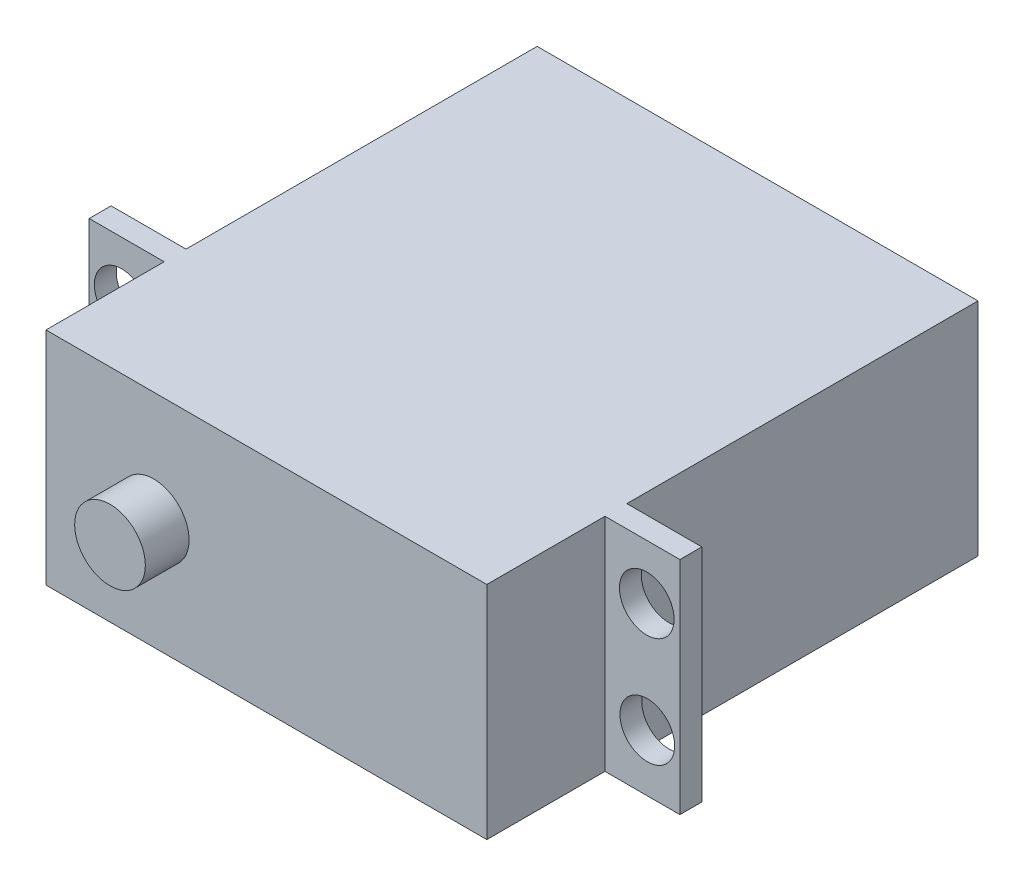
ISO-10303-21;
HEADER;
FILE_DESCRIPTION(('STEP AP214'),'2;1');
FILE_NAME('part.step','',(''),(''),'','','');
FILE_SCHEMA(('AUTOMOTIVE_DESIGN { 1 0 10303 214 1 1 1 1 }'));
ENDSEC;
DATA;
#1=APPLICATION_CONTEXT('core data for automotive mechanical design processes');
#2=APPLICATION_PROTOCOL_DEFINITION('international standard','automotive_design',2000,#1);
#3=PRODUCT_CONTEXT('',#1,'mechanical');
#4=PRODUCT('Part','Part','',(#3));
#5=PRODUCT_RELATED_PRODUCT_CATEGORY('part','',(#4));
#6=PRODUCT_DEFINITION_FORMATION('','',#4);
#7=PRODUCT_DEFINITION_CONTEXT('part definition',#1,'design');
#8=PRODUCT_DEFINITION('design','',#6,#7);
#9=PRODUCT_DEFINITION_SHAPE('','',#8);
#10=(LENGTH_UNIT() NAMED_UNIT(*) SI_UNIT(.MILLI.,.METRE.));
#11=(NAMED_UNIT(*) PLANE_ANGLE_UNIT() SI_UNIT($,.RADIAN.));
#12=(NAMED_UNIT(*) SI_UNIT($,.STERADIAN.) SOLID_ANGLE_UNIT());
#13=UNCERTAINTY_MEASURE_WITH_UNIT(LENGTH_MEASURE(1.E-05),#10,'distance_accuracy_value','');
#14=(GEOMETRIC_REPRESENTATION_CONTEXT(3) GLOBAL_UNCERTAINTY_ASSIGNED_CONTEXT((#13)) GLOBAL_UNIT_ASSIGNED_CONTEXT((#10,
#11,#12)) REPRESENTATION_CONTEXT('',''));
#15=CARTESIAN_POINT('',(0.,0.,0.));
#16=DIRECTION('',(0.,0.,1.));
#17=DIRECTION('',(1.,0.,0.));
#18=AXIS2_PLACEMENT_3D('',#15,#16,#17);
#19=CARTESIAN_POINT('',(0.,0.,34.1));
#20=DIRECTION('',(0.,0.,1.));
#21=DIRECTION('',(1.,0.,0.));
#22=AXIS2_PLACEMENT_3D('',#19,#20,#21);
#23=PLANE('',#22);
#24=CARTESIAN_POINT('',(-3.83205536866129,0.591291405632442,34.1));
#25=DIRECTION('',(0.,0.,1.));
#26=DIRECTION('',(1.,0.,0.));
#27=AXIS2_PLACEMENT_3D('',#24,#25,#26);
#28=CIRCLE('',#27,2.5);
#29=CARTESIAN_POINT('',(-1.33205536866129,0.591291405632442,34.1));
#30=VERTEX_POINT('',#29);
#31=EDGE_CURVE('E193',#30,#30,#28,.T.);
#32=ORIENTED_EDGE('',*,*,#31,.F.);
#33=EDGE_LOOP('',(#32));
#34=FACE_BOUND('',#33,.T.);
#35=CARTESIAN_POINT('',(-3.87999999999999,10.5911764705882,34.1));
#36=DIRECTION('',(0.,0.,1.));
#37=DIRECTION('',(1.,0.,0.));
#38=AXIS2_PLACEMENT_3D('',#35,#36,#37);
#39=CIRCLE('',#38,2.5);
#40=CARTESIAN_POINT('',(-1.37999999999999,10.5911764705882,34.1));
#41=VERTEX_POINT('',#40);
#42=EDGE_CURVE('E190',#41,#41,#39,.T.);
#43=ORIENTED_EDGE('',*,*,#42,.F.);
#44=EDGE_LOOP('',(#43));
#45=FACE_BOUND('',#44,.T.);
#46=DIRECTION('',(0.,-1.,0.));
#47=VECTOR('',#46,1.);
#48=CARTESIAN_POINT('',(0.,-4.60882352941177,34.1));
#49=LINE('',#48,#47);
#50=CARTESIAN_POINT('',(0.,15.5911764705882,34.1));
#51=VERTEX_POINT('',#50);
#52=CARTESIAN_POINT('',(0.,-4.60882352941177,34.1));
#53=VERTEX_POINT('',#52);
#54=EDGE_CURVE('E54',#51,#53,#49,.T.);
#55=ORIENTED_EDGE('',*,*,#54,.F.);
#56=DIRECTION('',(-1.,0.,0.));
#57=VECTOR('',#56,1.);
#58=CARTESIAN_POINT('',(-6.85,15.5911764705882,34.1));
#59=LINE('',#58,#57);
#60=CARTESIAN_POINT('',(-6.85,15.5911764705882,34.1));
#61=VERTEX_POINT('',#60);
#62=EDGE_CURVE('E177',#51,#61,#59,.T.);
#63=ORIENTED_EDGE('',*,*,#62,.T.);
#64=DIRECTION('',(0.,-1.,0.));
#65=VECTOR('',#64,1.);
#66=CARTESIAN_POINT('',(-6.85,15.5911764705882,34.1));
#67=LINE('',#66,#65);
#68=CARTESIAN_POINT('',(-6.85,-4.60882352941177,34.1));
#69=VERTEX_POINT('',#68);
#70=EDGE_CURVE('E172',#61,#69,#67,.T.);
#71=ORIENTED_EDGE('',*,*,#70,.T.);
#72=DIRECTION('',(1.,0.,0.));
#73=VECTOR('',#72,1.);
#74=CARTESIAN_POINT('',(-6.85,-4.60882352941177,34.1));
#75=LINE('',#74,#73);
#76=EDGE_CURVE('E286',#69,#53,#75,.T.);
#77=ORIENTED_EDGE('',*,*,#76,.T.);
#78=EDGE_LOOP('',(#55,#63,#71,#77));
#79=FACE_BOUND('',#78,.T.);
#80=ADVANCED_FACE('F37',(#34,#45,#79),#23,.T.);
#81=CARTESIAN_POINT('',(0.,15.5911764705882,32.1));
#82=DIRECTION('',(1.,0.,0.));
#83=DIRECTION('',(0.,1.,0.));
#84=AXIS2_PLACEMENT_3D('',#81,#82,#83);
#85=PLANE('',#84);
#86=DIRECTION('',(0.,-1.,0.));
#87=VECTOR('',#86,1.);
#88=CARTESIAN_POINT('',(0.,15.5911764705882,0.));
#89=LINE('',#88,#87);
#90=CARTESIAN_POINT('',(0.,15.5911764705882,0.));
#91=VERTEX_POINT('',#90);
#92=CARTESIAN_POINT('',(0.,-4.60882352941177,0.));
#93=VERTEX_POINT('',#92);
#94=EDGE_CURVE('E268',#91,#93,#89,.T.);
#95=ORIENTED_EDGE('',*,*,#94,.T.);
#96=DIRECTION('',(0.,0.,-1.));
#97=VECTOR('',#96,1.);
#98=CARTESIAN_POINT('',(0.,-4.60882352941177,32.1));
#99=LINE('',#98,#97);
#100=CARTESIAN_POINT('',(0.,-4.60882352941177,32.1));
#101=VERTEX_POINT('',#100);
#102=EDGE_CURVE('E46',#101,#93,#99,.T.);
#103=ORIENTED_EDGE('',*,*,#102,.F.);
#104=DIRECTION('',(0.,-1.,0.));
#105=VECTOR('',#104,1.);
#106=CARTESIAN_POINT('',(0.,15.5911764705882,32.1));
#107=LINE('',#106,#105);
#108=CARTESIAN_POINT('',(0.,15.5911764705882,32.1));
#109=VERTEX_POINT('',#108);
#110=EDGE_CURVE('E301',#109,#101,#107,.T.);
#111=ORIENTED_EDGE('',*,*,#110,.F.);
#112=DIRECTION('',(0.,0.,-1.));
#113=VECTOR('',#112,1.);
#114=CARTESIAN_POINT('',(0.,15.5911764705882,32.1));
#115=LINE('',#114,#113);
#116=EDGE_CURVE('E292',#109,#91,#115,.T.);
#117=ORIENTED_EDGE('',*,*,#116,.T.);
#118=EDGE_LOOP('',(#95,#103,#111,#117));
#119=FACE_BOUND('',#118,.T.);
#120=ADVANCED_FACE('F39',(#119),#85,.F.);
#121=CARTESIAN_POINT('',(0.,-4.60882352941177,32.1));
#122=DIRECTION('',(0.,1.,0.));
#123=DIRECTION('',(0.,0.,1.));
#124=AXIS2_PLACEMENT_3D('',#121,#122,#123);
#125=PLANE('',#124);
#126=DIRECTION('',(1.,0.,0.));
#127=VECTOR('',#126,1.);
#128=CARTESIAN_POINT('',(0.,-4.60882352941177,0.));
#129=LINE('',#128,#127);
#130=CARTESIAN_POINT('',(40.3,-4.60882352941177,0.));
#131=VERTEX_POINT('',#130);
#132=EDGE_CURVE('E316',#93,#131,#129,.T.);
#133=ORIENTED_EDGE('',*,*,#132,.T.);
#134=DIRECTION('',(0.,0.,-1.));
#135=VECTOR('',#134,1.);
#136=CARTESIAN_POINT('',(40.3,-4.60882352941177,32.1));
#137=LINE('',#136,#135);
#138=CARTESIAN_POINT('',(40.3,-4.60882352941177,32.1));
#139=VERTEX_POINT('',#138);
#140=EDGE_CURVE('E300',#139,#131,#137,.T.);
#141=ORIENTED_EDGE('',*,*,#140,.F.);
#142=DIRECTION('',(1.,0.,0.));
#143=VECTOR('',#142,1.);
#144=CARTESIAN_POINT('',(-6.85,-4.60882352941177,32.1));
#145=LINE('',#144,#143);
#146=CARTESIAN_POINT('',(47.15,-4.60882352941177,32.1));
#147=VERTEX_POINT('',#146);
#148=EDGE_CURVE('E152',#139,#147,#145,.T.);
#149=ORIENTED_EDGE('',*,*,#148,.T.);
#150=DIRECTION('',(0.,0.,-1.));
#151=VECTOR('',#150,1.);
#152=CARTESIAN_POINT('',(47.15,-4.60882352941177,34.1));
#153=LINE('',#152,#151);
#154=CARTESIAN_POINT('',(47.15,-4.60882352941177,34.1));
#155=VERTEX_POINT('',#154);
#156=EDGE_CURVE('E269',#155,#147,#153,.T.);
#157=ORIENTED_EDGE('',*,*,#156,.F.);
#158=CARTESIAN_POINT('',(40.3,-4.60882352941177,34.1));
#159=VERTEX_POINT('',#158);
#160=EDGE_CURVE('E281',#159,#155,#75,.T.);
#161=ORIENTED_EDGE('',*,*,#160,.F.);
#162=DIRECTION('',(0.,0.,-1.));
#163=VECTOR('',#162,1.);
#164=CARTESIAN_POINT('',(40.3,-4.60882352941177,44.9));
#165=LINE('',#164,#163);
#166=CARTESIAN_POINT('',(40.3,-4.60882352941177,44.9));
#167=VERTEX_POINT('',#166);
#168=EDGE_CURVE('E134',#167,#159,#165,.T.);
#169=ORIENTED_EDGE('',*,*,#168,.F.);
#170=DIRECTION('',(1.,0.,0.));
#171=VECTOR('',#170,1.);
#172=CARTESIAN_POINT('',(0.,-4.60882352941177,44.9));
#173=LINE('',#172,#171);
#174=CARTESIAN_POINT('',(0.,-4.60882352941177,44.9));
#175=VERTEX_POINT('',#174);
#176=EDGE_CURVE('E128',#175,#167,#173,.T.);
#177=ORIENTED_EDGE('',*,*,#176,.F.);
#178=DIRECTION('',(0.,0.,-1.));
#179=VECTOR('',#178,1.);
#180=CARTESIAN_POINT('',(0.,-4.60882352941177,44.9));
#181=LINE('',#180,#179);
#182=EDGE_CURVE('E132',#175,#53,#181,.T.);
#183=ORIENTED_EDGE('',*,*,#182,.T.);
#184=ORIENTED_EDGE('',*,*,#76,.F.);
#185=DIRECTION('',(0.,0.,-1.));
#186=VECTOR('',#185,1.);
#187=CARTESIAN_POINT('',(-6.85,-4.60882352941177,34.1));
#188=LINE('',#187,#186);
#189=CARTESIAN_POINT('',(-6.85,-4.60882352941177,32.1));
#190=VERTEX_POINT('',#189);
#191=EDGE_CURVE('E265',#69,#190,#188,.T.);
#192=ORIENTED_EDGE('',*,*,#191,.T.);
#193=EDGE_CURVE('E243',#190,#101,#145,.T.);
#194=ORIENTED_EDGE('',*,*,#193,.T.);
#195=ORIENTED_EDGE('',*,*,#102,.T.);
#196=EDGE_LOOP('',(#133,#141,#149,#157,#161,#169,#177,#183,#184,#192,#194,#195));
#197=FACE_BOUND('',#196,.T.);
#198=ADVANCED_FACE('F130',(#197),#125,.F.);
#199=CARTESIAN_POINT('',(40.3,15.5911764705882,32.1));
#200=DIRECTION('',(-1.,0.,0.));
#201=DIRECTION('',(0.,-1.,0.));
#202=AXIS2_PLACEMENT_3D('',#199,#200,#201);
#203=PLANE('',#202);
#204=DIRECTION('',(0.,1.,0.));
#205=VECTOR('',#204,1.);
#206=CARTESIAN_POINT('',(40.3,15.5911764705882,0.));
#207=LINE('',#206,#205);
#208=CARTESIAN_POINT('',(40.3,15.5911764705882,0.));
#209=VERTEX_POINT('',#208);
#210=EDGE_CURVE('E318',#131,#209,#207,.T.);
#211=ORIENTED_EDGE('',*,*,#210,.T.);
#212=DIRECTION('',(0.,0.,-1.));
#213=VECTOR('',#212,1.);
#214=CARTESIAN_POINT('',(40.3,15.5911764705882,32.1));
#215=LINE('',#214,#213);
#216=CARTESIAN_POINT('',(40.3,15.5911764705882,32.1));
#217=VERTEX_POINT('',#216);
#218=EDGE_CURVE('E295',#217,#209,#215,.T.);
#219=ORIENTED_EDGE('',*,*,#218,.F.);
#220=DIRECTION('',(0.,1.,0.));
#221=VECTOR('',#220,1.);
#222=CARTESIAN_POINT('',(40.3,15.5911764705882,32.1));
#223=LINE('',#222,#221);
#224=EDGE_CURVE('E238',#139,#217,#223,.T.);
#225=ORIENTED_EDGE('',*,*,#224,.F.);
#226=ORIENTED_EDGE('',*,*,#140,.T.);
#227=EDGE_LOOP('',(#211,#219,#225,#226));
#228=FACE_BOUND('',#227,.T.);
#229=ADVANCED_FACE('F459',(#228),#203,.F.);
#230=CARTESIAN_POINT('',(0.,15.5911764705882,32.1));
#231=DIRECTION('',(0.,-1.,0.));
#232=DIRECTION('',(0.,0.,-1.));
#233=AXIS2_PLACEMENT_3D('',#230,#231,#232);
#234=PLANE('',#233);
#235=DIRECTION('',(-1.,0.,0.));
#236=VECTOR('',#235,1.);
#237=CARTESIAN_POINT('',(0.,15.5911764705882,0.));
#238=LINE('',#237,#236);
#239=EDGE_CURVE('E304',#209,#91,#238,.T.);
#240=ORIENTED_EDGE('',*,*,#239,.T.);
#241=ORIENTED_EDGE('',*,*,#116,.F.);
#242=DIRECTION('',(-1.,0.,0.));
#243=VECTOR('',#242,1.);
#244=CARTESIAN_POINT('',(-6.85,15.5911764705882,32.1));
#245=LINE('',#244,#243);
#246=CARTESIAN_POINT('',(-6.85,15.5911764705882,32.1));
#247=VERTEX_POINT('',#246);
#248=EDGE_CURVE('E256',#109,#247,#245,.T.);
#249=ORIENTED_EDGE('',*,*,#248,.T.);
#250=DIRECTION('',(0.,0.,-1.));
#251=VECTOR('',#250,1.);
#252=CARTESIAN_POINT('',(-6.85,15.5911764705882,34.1));
#253=LINE('',#252,#251);
#254=EDGE_CURVE('E259',#61,#247,#253,.T.);
#255=ORIENTED_EDGE('',*,*,#254,.F.);
#256=ORIENTED_EDGE('',*,*,#62,.F.);
#257=DIRECTION('',(0.,0.,-1.));
#258=VECTOR('',#257,1.);
#259=CARTESIAN_POINT('',(0.,15.5911764705882,44.9));
#260=LINE('',#259,#258);
#261=CARTESIAN_POINT('',(0.,15.5911764705882,44.9));
#262=VERTEX_POINT('',#261);
#263=EDGE_CURVE('E164',#262,#51,#260,.T.);
#264=ORIENTED_EDGE('',*,*,#263,.F.);
#265=DIRECTION('',(-1.,0.,0.));
#266=VECTOR('',#265,1.);
#267=CARTESIAN_POINT('',(0.,15.5911764705882,44.9));
#268=LINE('',#267,#266);
#269=CARTESIAN_POINT('',(40.3,15.5911764705882,44.9));
#270=VERTEX_POINT('',#269);
#271=EDGE_CURVE('E143',#270,#262,#268,.T.);
#272=ORIENTED_EDGE('',*,*,#271,.F.);
#273=DIRECTION('',(0.,0.,-1.));
#274=VECTOR('',#273,1.);
#275=CARTESIAN_POINT('',(40.3,15.5911764705882,44.9));
#276=LINE('',#275,#274);
#277=CARTESIAN_POINT('',(40.3,15.5911764705882,34.1));
#278=VERTEX_POINT('',#277);
#279=EDGE_CURVE('E154',#270,#278,#276,.T.);
#280=ORIENTED_EDGE('',*,*,#279,.T.);
#281=CARTESIAN_POINT('',(47.15,15.5911764705882,34.1));
#282=VERTEX_POINT('',#281);
#283=EDGE_CURVE('E274',#282,#278,#59,.T.);
#284=ORIENTED_EDGE('',*,*,#283,.F.);
#285=DIRECTION('',(0.,0.,-1.));
#286=VECTOR('',#285,1.);
#287=CARTESIAN_POINT('',(47.15,15.5911764705882,34.1));
#288=LINE('',#287,#286);
#289=CARTESIAN_POINT('',(47.15,15.5911764705882,32.1));
#290=VERTEX_POINT('',#289);
#291=EDGE_CURVE('E270',#282,#290,#288,.T.);
#292=ORIENTED_EDGE('',*,*,#291,.T.);
#293=EDGE_CURVE('E263',#290,#217,#245,.T.);
#294=ORIENTED_EDGE('',*,*,#293,.T.);
#295=ORIENTED_EDGE('',*,*,#218,.T.);
#296=EDGE_LOOP('',(#240,#241,#249,#255,#256,#264,#272,#280,#284,#292,#294,#295));
#297=FACE_BOUND('',#296,.T.);
#298=ADVANCED_FACE('F322',(#297),#234,.F.);
#299=CARTESIAN_POINT('',(0.,0.,0.));
#300=DIRECTION('',(0.,0.,1.));
#301=DIRECTION('',(1.,0.,0.));
#302=AXIS2_PLACEMENT_3D('',#299,#300,#301);
#303=PLANE('',#302);
#304=ORIENTED_EDGE('',*,*,#94,.F.);
#305=ORIENTED_EDGE('',*,*,#239,.F.);
#306=ORIENTED_EDGE('',*,*,#210,.F.);
#307=ORIENTED_EDGE('',*,*,#132,.F.);
#308=EDGE_LOOP('',(#304,#305,#306,#307));
#309=FACE_BOUND('',#308,.T.);
#310=ADVANCED_FACE('F327',(#309),#303,.F.);
#311=CARTESIAN_POINT('',(0.,0.,32.1));
#312=DIRECTION('',(0.,0.,1.));
#313=DIRECTION('',(1.,0.,0.));
#314=AXIS2_PLACEMENT_3D('',#311,#312,#313);
#315=PLANE('',#314);
#316=CARTESIAN_POINT('',(-3.83205536866129,0.591291405632442,32.1));
#317=DIRECTION('',(0.,0.,1.));
#318=DIRECTION('',(1.,0.,0.));
#319=AXIS2_PLACEMENT_3D('',#316,#317,#318);
#320=CIRCLE('',#319,2.5);
#321=CARTESIAN_POINT('',(-1.33205536866129,0.591291405632442,32.1));
#322=VERTEX_POINT('',#321);
#323=EDGE_CURVE('E41',#322,#322,#320,.T.);
#324=ORIENTED_EDGE('',*,*,#323,.T.);
#325=EDGE_LOOP('',(#324));
#326=FACE_BOUND('',#325,.T.);
#327=CARTESIAN_POINT('',(-3.87999999999999,10.5911764705882,32.1));
#328=DIRECTION('',(0.,0.,1.));
#329=DIRECTION('',(1.,0.,0.));
#330=AXIS2_PLACEMENT_3D('',#327,#328,#329);
#331=CIRCLE('',#330,2.5);
#332=CARTESIAN_POINT('',(-1.37999999999999,10.5911764705882,32.1));
#333=VERTEX_POINT('',#332);
#334=EDGE_CURVE('E189',#333,#333,#331,.T.);
#335=ORIENTED_EDGE('',*,*,#334,.T.);
#336=EDGE_LOOP('',(#335));
#337=FACE_BOUND('',#336,.T.);
#338=ORIENTED_EDGE('',*,*,#248,.F.);
#339=ORIENTED_EDGE('',*,*,#110,.T.);
#340=ORIENTED_EDGE('',*,*,#193,.F.);
#341=DIRECTION('',(0.,-1.,0.));
#342=VECTOR('',#341,1.);
#343=CARTESIAN_POINT('',(-6.85,15.5911764705882,32.1));
#344=LINE('',#343,#342);
#345=EDGE_CURVE('E149',#247,#190,#344,.T.);
#346=ORIENTED_EDGE('',*,*,#345,.F.);
#347=EDGE_LOOP('',(#338,#339,#340,#346));
#348=FACE_BOUND('',#347,.T.);
#349=ADVANCED_FACE('F230',(#326,#337,#348),#315,.F.);
#350=CARTESIAN_POINT('',(44.1679446313387,0.591291405632438,32.1));
#351=DIRECTION('',(0.,0.,1.));
#352=DIRECTION('',(1.,0.,0.));
#353=AXIS2_PLACEMENT_3D('',#350,#351,#352);
#354=CIRCLE('',#353,2.5);
#355=CARTESIAN_POINT('',(46.6679446313387,0.591291405632438,32.1));
#356=VERTEX_POINT('',#355);
#357=EDGE_CURVE('E202',#356,#356,#354,.T.);
#358=ORIENTED_EDGE('',*,*,#357,.T.);
#359=EDGE_LOOP('',(#358));
#360=FACE_BOUND('',#359,.T.);
#361=CARTESIAN_POINT('',(44.12,10.5911764705882,32.1));
#362=DIRECTION('',(0.,0.,1.));
#363=DIRECTION('',(1.,0.,0.));
#364=AXIS2_PLACEMENT_3D('',#361,#362,#363);
#365=CIRCLE('',#364,2.5);
#366=CARTESIAN_POINT('',(46.62,10.5911764705882,32.1));
#367=VERTEX_POINT('',#366);
#368=EDGE_CURVE('E196',#367,#367,#365,.T.);
#369=ORIENTED_EDGE('',*,*,#368,.T.);
#370=EDGE_LOOP('',(#369));
#371=FACE_BOUND('',#370,.T.);
#372=ORIENTED_EDGE('',*,*,#148,.F.);
#373=ORIENTED_EDGE('',*,*,#224,.T.);
#374=ORIENTED_EDGE('',*,*,#293,.F.);
#375=DIRECTION('',(0.,1.,0.));
#376=VECTOR('',#375,1.);
#377=CARTESIAN_POINT('',(47.15,15.5911764705882,32.1));
#378=LINE('',#377,#376);
#379=EDGE_CURVE('E240',#147,#290,#378,.T.);
#380=ORIENTED_EDGE('',*,*,#379,.F.);
#381=EDGE_LOOP('',(#372,#373,#374,#380));
#382=FACE_BOUND('',#381,.T.);
#383=ADVANCED_FACE('F226',(#360,#371,#382),#315,.F.);
#384=CARTESIAN_POINT('',(-6.85,15.5911764705882,34.1));
#385=DIRECTION('',(1.,0.,0.));
#386=DIRECTION('',(0.,1.,0.));
#387=AXIS2_PLACEMENT_3D('',#384,#385,#386);
#388=PLANE('',#387);
#389=ORIENTED_EDGE('',*,*,#345,.T.);
#390=ORIENTED_EDGE('',*,*,#191,.F.);
#391=ORIENTED_EDGE('',*,*,#70,.F.);
#392=ORIENTED_EDGE('',*,*,#254,.T.);
#393=EDGE_LOOP('',(#389,#390,#391,#392));
#394=FACE_BOUND('',#393,.T.);
#395=ADVANCED_FACE('F229',(#394),#388,.F.);
#396=CARTESIAN_POINT('',(47.15,15.5911764705882,34.1));
#397=DIRECTION('',(-1.,0.,0.));
#398=DIRECTION('',(0.,0.,1.));
#399=AXIS2_PLACEMENT_3D('',#396,#397,#398);
#400=PLANE('',#399);
#401=ORIENTED_EDGE('',*,*,#379,.T.);
#402=ORIENTED_EDGE('',*,*,#291,.F.);
#403=DIRECTION('',(0.,1.,0.));
#404=VECTOR('',#403,1.);
#405=CARTESIAN_POINT('',(47.15,15.5911764705882,34.1));
#406=LINE('',#405,#404);
#407=EDGE_CURVE('E279',#155,#282,#406,.T.);
#408=ORIENTED_EDGE('',*,*,#407,.F.);
#409=ORIENTED_EDGE('',*,*,#156,.T.);
#410=EDGE_LOOP('',(#401,#402,#408,#409));
#411=FACE_BOUND('',#410,.T.);
#412=ADVANCED_FACE('F215',(#411),#400,.F.);
#413=CARTESIAN_POINT('',(44.1679446313387,0.591291405632438,34.1));
#414=DIRECTION('',(0.,0.,1.));
#415=DIRECTION('',(1.,0.,0.));
#416=AXIS2_PLACEMENT_3D('',#413,#414,#415);
#417=CIRCLE('',#416,2.5);
#418=CARTESIAN_POINT('',(46.6679446313387,0.591291405632438,34.1));
#419=VERTEX_POINT('',#418);
#420=EDGE_CURVE('E205',#419,#419,#417,.T.);
#421=ORIENTED_EDGE('',*,*,#420,.F.);
#422=EDGE_LOOP('',(#421));
#423=FACE_BOUND('',#422,.T.);
#424=CARTESIAN_POINT('',(44.12,10.5911764705882,34.1));
#425=DIRECTION('',(0.,0.,1.));
#426=DIRECTION('',(1.,0.,0.));
#427=AXIS2_PLACEMENT_3D('',#424,#425,#426);
#428=CIRCLE('',#427,2.5);
#429=CARTESIAN_POINT('',(46.62,10.5911764705882,34.1));
#430=VERTEX_POINT('',#429);
#431=EDGE_CURVE('E199',#430,#430,#428,.T.);
#432=ORIENTED_EDGE('',*,*,#431,.F.);
#433=EDGE_LOOP('',(#432));
#434=FACE_BOUND('',#433,.T.);
#435=DIRECTION('',(0.,1.,0.));
#436=VECTOR('',#435,1.);
#437=CARTESIAN_POINT('',(40.3,-4.60882352941177,34.1));
#438=LINE('',#437,#436);
#439=EDGE_CURVE('E62',#159,#278,#438,.T.);
#440=ORIENTED_EDGE('',*,*,#439,.F.);
#441=ORIENTED_EDGE('',*,*,#160,.T.);
#442=ORIENTED_EDGE('',*,*,#407,.T.);
#443=ORIENTED_EDGE('',*,*,#283,.T.);
#444=EDGE_LOOP('',(#440,#441,#442,#443));
#445=FACE_BOUND('',#444,.T.);
#446=ADVANCED_FACE('F212',(#423,#434,#445),#23,.T.);
#447=CARTESIAN_POINT('',(0.,-4.60882352941177,44.9));
#448=DIRECTION('',(1.,0.,0.));
#449=DIRECTION('',(0.,0.,-1.));
#450=AXIS2_PLACEMENT_3D('',#447,#448,#449);
#451=PLANE('',#450);
#452=ORIENTED_EDGE('',*,*,#54,.T.);
#453=ORIENTED_EDGE('',*,*,#182,.F.);
#454=DIRECTION('',(0.,-1.,0.));
#455=VECTOR('',#454,1.);
#456=CARTESIAN_POINT('',(0.,-4.60882352941177,44.9));
#457=LINE('',#456,#455);
#458=EDGE_CURVE('E138',#262,#175,#457,.T.);
#459=ORIENTED_EDGE('',*,*,#458,.F.);
#460=ORIENTED_EDGE('',*,*,#263,.T.);
#461=EDGE_LOOP('',(#452,#453,#459,#460));
#462=FACE_BOUND('',#461,.T.);
#463=ADVANCED_FACE('F148',(#462),#451,.F.);
#464=CARTESIAN_POINT('',(40.3,-4.60882352941177,44.9));
#465=DIRECTION('',(-1.,0.,0.));
#466=DIRECTION('',(0.,0.,1.));
#467=AXIS2_PLACEMENT_3D('',#464,#465,#466);
#468=PLANE('',#467);
#469=ORIENTED_EDGE('',*,*,#439,.T.);
#470=ORIENTED_EDGE('',*,*,#279,.F.);
#471=DIRECTION('',(0.,1.,0.));
#472=VECTOR('',#471,1.);
#473=CARTESIAN_POINT('',(40.3,-4.60882352941177,44.9));
#474=LINE('',#473,#472);
#475=EDGE_CURVE('E137',#167,#270,#474,.T.);
#476=ORIENTED_EDGE('',*,*,#475,.F.);
#477=ORIENTED_EDGE('',*,*,#168,.T.);
#478=EDGE_LOOP('',(#469,#470,#476,#477));
#479=FACE_BOUND('',#478,.T.);
#480=ADVANCED_FACE('F383',(#479),#468,.F.);
#481=CARTESIAN_POINT('',(0.,0.,44.9));
#482=DIRECTION('',(0.,0.,-1.));
#483=DIRECTION('',(-1.,0.,0.));
#484=AXIS2_PLACEMENT_3D('',#481,#482,#483);
#485=PLANE('',#484);
#486=CARTESIAN_POINT('',(9.85,5.49117647058823,44.9));
#487=DIRECTION('',(0.,0.,-1.));
#488=DIRECTION('',(-1.,0.,0.));
#489=AXIS2_PLACEMENT_3D('',#486,#487,#488);
#490=CIRCLE('',#489,3.23010648850891);
#491=CARTESIAN_POINT('',(6.61989351149109,5.49117647058823,44.9));
#492=VERTEX_POINT('',#491);
#493=EDGE_CURVE('E11',#492,#492,#490,.F.);
#494=ORIENTED_EDGE('',*,*,#493,.F.);
#495=EDGE_LOOP('',(#494));
#496=FACE_BOUND('',#495,.T.);
#497=ORIENTED_EDGE('',*,*,#458,.T.);
#498=ORIENTED_EDGE('',*,*,#176,.T.);
#499=ORIENTED_EDGE('',*,*,#475,.T.);
#500=ORIENTED_EDGE('',*,*,#271,.T.);
#501=EDGE_LOOP('',(#497,#498,#499,#500));
#502=FACE_BOUND('',#501,.T.);
#503=ADVANCED_FACE('F141',(#496,#502),#485,.F.);
#504=CARTESIAN_POINT('',(9.85,5.49117647058823,48.9));
#505=DIRECTION('',(0.,0.,-1.));
#506=DIRECTION('',(-1.,0.,0.));
#507=AXIS2_PLACEMENT_3D('',#504,#505,#506);
#508=CYLINDRICAL_SURFACE('',#507,3.23010648850891);
#509=CARTESIAN_POINT('',(9.85,5.49117647058823,48.9));
#510=DIRECTION('',(0.,0.,1.));
#511=DIRECTION('',(1.,0.,0.));
#512=AXIS2_PLACEMENT_3D('',#509,#510,#511);
#513=CIRCLE('',#512,3.23010648850891);
#514=CARTESIAN_POINT('',(13.0801064885089,5.49117647058823,48.9));
#515=VERTEX_POINT('',#514);
#516=EDGE_CURVE('E163',#515,#515,#513,.T.);
#517=ORIENTED_EDGE('',*,*,#516,.F.);
#518=EDGE_LOOP('',(#517));
#519=FACE_BOUND('',#518,.T.);
#520=ORIENTED_EDGE('',*,*,#493,.T.);
#521=EDGE_LOOP('',(#520));
#522=FACE_BOUND('',#521,.T.);
#523=ADVANCED_FACE('F375',(#519,#522),#508,.T.);
#524=CARTESIAN_POINT('',(9.85,5.49117647058823,48.9));
#525=DIRECTION('',(0.,0.,1.));
#526=DIRECTION('',(1.,0.,0.));
#527=AXIS2_PLACEMENT_3D('',#524,#525,#526);
#528=PLANE('',#527);
#529=ORIENTED_EDGE('',*,*,#516,.T.);
#530=EDGE_LOOP('',(#529));
#531=FACE_BOUND('',#530,.T.);
#532=ADVANCED_FACE('F366',(#531),#528,.T.);
#533=CARTESIAN_POINT('',(-3.87999999999999,10.5911764705882,30.1));
#534=DIRECTION('',(0.,0.,1.));
#535=DIRECTION('',(1.,0.,0.));
#536=AXIS2_PLACEMENT_3D('',#533,#534,#535);
#537=CYLINDRICAL_SURFACE('',#536,2.5);
#538=ORIENTED_EDGE('',*,*,#42,.T.);
#539=EDGE_LOOP('',(#538));
#540=FACE_BOUND('',#539,.T.);
#541=ORIENTED_EDGE('',*,*,#334,.F.);
#542=EDGE_LOOP('',(#541));
#543=FACE_BOUND('',#542,.T.);
#544=ADVANCED_FACE('F364',(#540,#543),#537,.F.);
#545=CARTESIAN_POINT('',(-3.83205536866129,0.591291405632442,30.1));
#546=DIRECTION('',(0.,0.,1.));
#547=DIRECTION('',(1.,0.,0.));
#548=AXIS2_PLACEMENT_3D('',#545,#546,#547);
#549=CYLINDRICAL_SURFACE('',#548,2.5);
#550=ORIENTED_EDGE('',*,*,#31,.T.);
#551=EDGE_LOOP('',(#550));
#552=FACE_BOUND('',#551,.T.);
#553=ORIENTED_EDGE('',*,*,#323,.F.);
#554=EDGE_LOOP('',(#553));
#555=FACE_BOUND('',#554,.T.);
#556=ADVANCED_FACE('F222',(#552,#555),#549,.F.);
#557=CARTESIAN_POINT('',(44.12,10.5911764705882,30.1));
#558=DIRECTION('',(0.,0.,1.));
#559=DIRECTION('',(1.,0.,0.));
#560=AXIS2_PLACEMENT_3D('',#557,#558,#559);
#561=CYLINDRICAL_SURFACE('',#560,2.5);
#562=ORIENTED_EDGE('',*,*,#431,.T.);
#563=EDGE_LOOP('',(#562));
#564=FACE_BOUND('',#563,.T.);
#565=ORIENTED_EDGE('',*,*,#368,.F.);
#566=EDGE_LOOP('',(#565));
#567=FACE_BOUND('',#566,.T.);
#568=ADVANCED_FACE('F219',(#564,#567),#561,.F.);
#569=CARTESIAN_POINT('',(44.1679446313387,0.591291405632438,30.1));
#570=DIRECTION('',(0.,0.,1.));
#571=DIRECTION('',(1.,0.,0.));
#572=AXIS2_PLACEMENT_3D('',#569,#570,#571);
#573=CYLINDRICAL_SURFACE('',#572,2.5);
#574=ORIENTED_EDGE('',*,*,#420,.T.);
#575=EDGE_LOOP('',(#574));
#576=FACE_BOUND('',#575,.T.);
#577=ORIENTED_EDGE('',*,*,#357,.F.);
#578=EDGE_LOOP('',(#577));
#579=FACE_BOUND('',#578,.T.);
#580=ADVANCED_FACE('F209',(#576,#579),#573,.F.);
#581=CLOSED_SHELL('',(#80,#120,#198,#229,#298,#310,#349,#383,#395,#412,#446,#463,#480,#503,#523,
#532,#544,#556,#568,#580));
#582=MANIFOLD_SOLID_BREP('B2',#581);
#583=ADVANCED_BREP_SHAPE_REPRESENTATION('',(#18,#582),#14);
#584=SHAPE_DEFINITION_REPRESENTATION(#9,#583);
ENDSEC;
END-ISO-10303-21;
